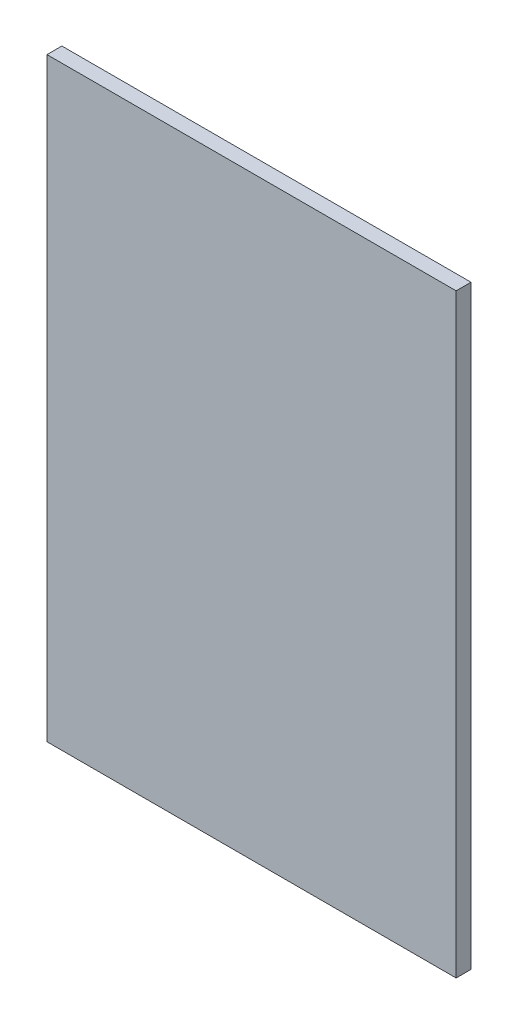
ISO-10303-21;
HEADER;
FILE_DESCRIPTION(('STEP AP214'),'2;1');
FILE_NAME('part.step','',(''),(''),'','','');
FILE_SCHEMA(('AUTOMOTIVE_DESIGN { 1 0 10303 214 1 1 1 1 }'));
ENDSEC;
DATA;
#1=APPLICATION_CONTEXT('core data for automotive mechanical design processes');
#2=APPLICATION_PROTOCOL_DEFINITION('international standard','automotive_design',2000,#1);
#3=PRODUCT_CONTEXT('',#1,'mechanical');
#4=PRODUCT('Part','Part','',(#3));
#5=PRODUCT_RELATED_PRODUCT_CATEGORY('part','',(#4));
#6=PRODUCT_DEFINITION_FORMATION('','',#4);
#7=PRODUCT_DEFINITION_CONTEXT('part definition',#1,'design');
#8=PRODUCT_DEFINITION('design','',#6,#7);
#9=PRODUCT_DEFINITION_SHAPE('','',#8);
#10=(LENGTH_UNIT() NAMED_UNIT(*) SI_UNIT(.MILLI.,.METRE.));
#11=(NAMED_UNIT(*) PLANE_ANGLE_UNIT() SI_UNIT($,.RADIAN.));
#12=(NAMED_UNIT(*) SI_UNIT($,.STERADIAN.) SOLID_ANGLE_UNIT());
#13=UNCERTAINTY_MEASURE_WITH_UNIT(LENGTH_MEASURE(1.E-05),#10,'distance_accuracy_value','');
#14=(GEOMETRIC_REPRESENTATION_CONTEXT(3) GLOBAL_UNCERTAINTY_ASSIGNED_CONTEXT((#13)) GLOBAL_UNIT_ASSIGNED_CONTEXT((#10,
#11,#12)) REPRESENTATION_CONTEXT('',''));
#15=CARTESIAN_POINT('',(0.,0.,0.));
#16=DIRECTION('',(0.,0.,1.));
#17=DIRECTION('',(1.,0.,0.));
#18=AXIS2_PLACEMENT_3D('',#15,#16,#17);
#19=CARTESIAN_POINT('',(0.,0.,6.));
#20=DIRECTION('',(-1.,0.,0.));
#21=DIRECTION('',(0.,-1.,0.));
#22=AXIS2_PLACEMENT_3D('',#19,#20,#21);
#23=PLANE('',#22);
#24=DIRECTION('',(0.,1.,0.));
#25=VECTOR('',#24,1.);
#26=CARTESIAN_POINT('',(0.,0.,0.));
#27=LINE('',#26,#25);
#28=CARTESIAN_POINT('',(0.,0.,0.));
#29=VERTEX_POINT('',#28);
#30=CARTESIAN_POINT('',(0.,240.,0.));
#31=VERTEX_POINT('',#30);
#32=EDGE_CURVE('E96',#29,#31,#27,.T.);
#33=ORIENTED_EDGE('',*,*,#32,.T.);
#34=DIRECTION('',(0.,0.,-1.));
#35=VECTOR('',#34,1.);
#36=CARTESIAN_POINT('',(0.,240.,6.));
#37=LINE('',#36,#35);
#38=CARTESIAN_POINT('',(0.,240.,6.));
#39=VERTEX_POINT('',#38);
#40=EDGE_CURVE('E11',#39,#31,#37,.T.);
#41=ORIENTED_EDGE('',*,*,#40,.F.);
#42=DIRECTION('',(0.,1.,0.));
#43=VECTOR('',#42,1.);
#44=CARTESIAN_POINT('',(0.,0.,6.));
#45=LINE('',#44,#43);
#46=CARTESIAN_POINT('',(0.,0.,6.));
#47=VERTEX_POINT('',#46);
#48=EDGE_CURVE('E84',#47,#39,#45,.T.);
#49=ORIENTED_EDGE('',*,*,#48,.F.);
#50=DIRECTION('',(0.,0.,-1.));
#51=VECTOR('',#50,1.);
#52=CARTESIAN_POINT('',(0.,0.,6.));
#53=LINE('',#52,#51);
#54=EDGE_CURVE('E92',#47,#29,#53,.T.);
#55=ORIENTED_EDGE('',*,*,#54,.T.);
#56=EDGE_LOOP('',(#33,#41,#49,#55));
#57=FACE_BOUND('',#56,.T.);
#58=ADVANCED_FACE('F33',(#57),#23,.F.);
#59=CARTESIAN_POINT('',(0.,240.,6.));
#60=DIRECTION('',(0.,-1.,0.));
#61=DIRECTION('',(1.,0.,0.));
#62=AXIS2_PLACEMENT_3D('',#59,#60,#61);
#63=PLANE('',#62);
#64=DIRECTION('',(-1.,0.,0.));
#65=VECTOR('',#64,1.);
#66=CARTESIAN_POINT('',(0.,240.,0.));
#67=LINE('',#66,#65);
#68=CARTESIAN_POINT('',(-165.,240.,0.));
#69=VERTEX_POINT('',#68);
#70=EDGE_CURVE('E88',#31,#69,#67,.T.);
#71=ORIENTED_EDGE('',*,*,#70,.T.);
#72=DIRECTION('',(0.,0.,-1.));
#73=VECTOR('',#72,1.);
#74=CARTESIAN_POINT('',(-165.,240.,6.));
#75=LINE('',#74,#73);
#76=CARTESIAN_POINT('',(-165.,240.,6.));
#77=VERTEX_POINT('',#76);
#78=EDGE_CURVE('E41',#77,#69,#75,.T.);
#79=ORIENTED_EDGE('',*,*,#78,.F.);
#80=DIRECTION('',(-1.,0.,0.));
#81=VECTOR('',#80,1.);
#82=CARTESIAN_POINT('',(0.,240.,6.));
#83=LINE('',#82,#81);
#84=EDGE_CURVE('E79',#39,#77,#83,.T.);
#85=ORIENTED_EDGE('',*,*,#84,.F.);
#86=ORIENTED_EDGE('',*,*,#40,.T.);
#87=EDGE_LOOP('',(#71,#79,#85,#86));
#88=FACE_BOUND('',#87,.T.);
#89=ADVANCED_FACE('F87',(#88),#63,.F.);
#90=CARTESIAN_POINT('',(-165.,0.,6.));
#91=DIRECTION('',(1.,0.,0.));
#92=DIRECTION('',(0.,1.,0.));
#93=AXIS2_PLACEMENT_3D('',#90,#91,#92);
#94=PLANE('',#93);
#95=DIRECTION('',(0.,-1.,0.));
#96=VECTOR('',#95,1.);
#97=CARTESIAN_POINT('',(-165.,0.,0.));
#98=LINE('',#97,#96);
#99=CARTESIAN_POINT('',(-165.,0.,0.));
#100=VERTEX_POINT('',#99);
#101=EDGE_CURVE('E66',#69,#100,#98,.T.);
#102=ORIENTED_EDGE('',*,*,#101,.T.);
#103=DIRECTION('',(0.,0.,-1.));
#104=VECTOR('',#103,1.);
#105=CARTESIAN_POINT('',(-165.,0.,6.));
#106=LINE('',#105,#104);
#107=CARTESIAN_POINT('',(-165.,0.,6.));
#108=VERTEX_POINT('',#107);
#109=EDGE_CURVE('E89',#108,#100,#106,.T.);
#110=ORIENTED_EDGE('',*,*,#109,.F.);
#111=DIRECTION('',(0.,-1.,0.));
#112=VECTOR('',#111,1.);
#113=CARTESIAN_POINT('',(-165.,0.,6.));
#114=LINE('',#113,#112);
#115=EDGE_CURVE('E82',#77,#108,#114,.T.);
#116=ORIENTED_EDGE('',*,*,#115,.F.);
#117=ORIENTED_EDGE('',*,*,#78,.T.);
#118=EDGE_LOOP('',(#102,#110,#116,#117));
#119=FACE_BOUND('',#118,.T.);
#120=ADVANCED_FACE('F90',(#119),#94,.F.);
#121=CARTESIAN_POINT('',(0.,0.,6.));
#122=DIRECTION('',(0.,1.,0.));
#123=DIRECTION('',(-1.,0.,0.));
#124=AXIS2_PLACEMENT_3D('',#121,#122,#123);
#125=PLANE('',#124);
#126=DIRECTION('',(1.,0.,0.));
#127=VECTOR('',#126,1.);
#128=CARTESIAN_POINT('',(0.,0.,0.));
#129=LINE('',#128,#127);
#130=EDGE_CURVE('E72',#100,#29,#129,.T.);
#131=ORIENTED_EDGE('',*,*,#130,.T.);
#132=ORIENTED_EDGE('',*,*,#54,.F.);
#133=DIRECTION('',(1.,0.,0.));
#134=VECTOR('',#133,1.);
#135=CARTESIAN_POINT('',(0.,0.,6.));
#136=LINE('',#135,#134);
#137=EDGE_CURVE('E49',#108,#47,#136,.T.);
#138=ORIENTED_EDGE('',*,*,#137,.F.);
#139=ORIENTED_EDGE('',*,*,#109,.T.);
#140=EDGE_LOOP('',(#131,#132,#138,#139));
#141=FACE_BOUND('',#140,.T.);
#142=ADVANCED_FACE('F103',(#141),#125,.F.);
#143=CARTESIAN_POINT('',(0.,0.,6.));
#144=DIRECTION('',(0.,0.,1.));
#145=DIRECTION('',(1.,0.,0.));
#146=AXIS2_PLACEMENT_3D('',#143,#144,#145);
#147=PLANE('',#146);
#148=ORIENTED_EDGE('',*,*,#48,.T.);
#149=ORIENTED_EDGE('',*,*,#84,.T.);
#150=ORIENTED_EDGE('',*,*,#115,.T.);
#151=ORIENTED_EDGE('',*,*,#137,.T.);
#152=EDGE_LOOP('',(#148,#149,#150,#151));
#153=FACE_BOUND('',#152,.T.);
#154=ADVANCED_FACE('F80',(#153),#147,.T.);
#155=CARTESIAN_POINT('',(0.,0.,0.));
#156=DIRECTION('',(0.,0.,1.));
#157=DIRECTION('',(1.,0.,0.));
#158=AXIS2_PLACEMENT_3D('',#155,#156,#157);
#159=PLANE('',#158);
#160=ORIENTED_EDGE('',*,*,#32,.F.);
#161=ORIENTED_EDGE('',*,*,#130,.F.);
#162=ORIENTED_EDGE('',*,*,#101,.F.);
#163=ORIENTED_EDGE('',*,*,#70,.F.);
#164=EDGE_LOOP('',(#160,#161,#162,#163));
#165=FACE_BOUND('',#164,.T.);
#166=ADVANCED_FACE('F106',(#165),#159,.F.);
#167=CLOSED_SHELL('',(#58,#89,#120,#142,#154,#166));
#168=MANIFOLD_SOLID_BREP('B2',#167);
#169=ADVANCED_BREP_SHAPE_REPRESENTATION('',(#18,#168),#14);
#170=SHAPE_DEFINITION_REPRESENTATION(#9,#169);
ENDSEC;
END-ISO-10303-21;
